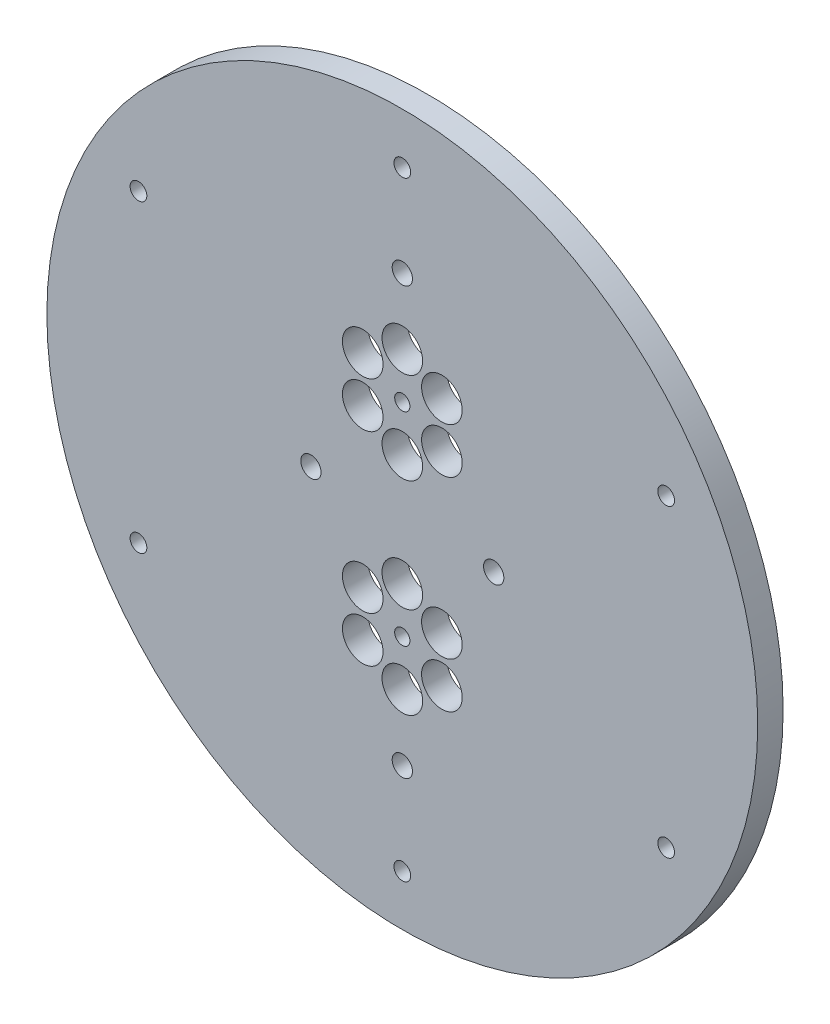
ISO-10303-21;
HEADER;
FILE_DESCRIPTION(('STEP AP214'),'2;1');
FILE_NAME('part.step','',(''),(''),'','','');
FILE_SCHEMA(('AUTOMOTIVE_DESIGN { 1 0 10303 214 1 1 1 1 }'));
ENDSEC;
DATA;
#1=APPLICATION_CONTEXT('core data for automotive mechanical design processes');
#2=APPLICATION_PROTOCOL_DEFINITION('international standard','automotive_design',2000,#1);
#3=PRODUCT_CONTEXT('',#1,'mechanical');
#4=PRODUCT('Part','Part','',(#3));
#5=PRODUCT_RELATED_PRODUCT_CATEGORY('part','',(#4));
#6=PRODUCT_DEFINITION_FORMATION('','',#4);
#7=PRODUCT_DEFINITION_CONTEXT('part definition',#1,'design');
#8=PRODUCT_DEFINITION('design','',#6,#7);
#9=PRODUCT_DEFINITION_SHAPE('','',#8);
#10=(LENGTH_UNIT() NAMED_UNIT(*) SI_UNIT(.MILLI.,.METRE.));
#11=(NAMED_UNIT(*) PLANE_ANGLE_UNIT() SI_UNIT($,.RADIAN.));
#12=(NAMED_UNIT(*) SI_UNIT($,.STERADIAN.) SOLID_ANGLE_UNIT());
#13=UNCERTAINTY_MEASURE_WITH_UNIT(LENGTH_MEASURE(1.E-05),#10,'distance_accuracy_value','');
#14=(GEOMETRIC_REPRESENTATION_CONTEXT(3) GLOBAL_UNCERTAINTY_ASSIGNED_CONTEXT((#13)) GLOBAL_UNIT_ASSIGNED_CONTEXT((#10,
#11,#12)) REPRESENTATION_CONTEXT('',''));
#15=CARTESIAN_POINT('',(0.,0.,0.));
#16=DIRECTION('',(0.,0.,1.));
#17=DIRECTION('',(1.,0.,0.));
#18=AXIS2_PLACEMENT_3D('',#15,#16,#17);
#19=CARTESIAN_POINT('',(0.,0.,5.));
#20=DIRECTION('',(0.,0.,1.));
#21=DIRECTION('',(1.,0.,0.));
#22=AXIS2_PLACEMENT_3D('',#19,#20,#21);
#23=PLANE('',#22);
#24=CARTESIAN_POINT('',(0.,42.,5.));
#25=DIRECTION('',(0.,0.,1.));
#26=DIRECTION('',(1.,0.,0.));
#27=AXIS2_PLACEMENT_3D('',#24,#25,#26);
#28=CIRCLE('',#27,2.);
#29=CARTESIAN_POINT('',(2.,42.,5.));
#30=VERTEX_POINT('',#29);
#31=EDGE_CURVE('E182',#30,#30,#28,.T.);
#32=ORIENTED_EDGE('',*,*,#31,.F.);
#33=EDGE_LOOP('',(#32));
#34=FACE_BOUND('',#33,.T.);
#35=CARTESIAN_POINT('',(0.,-42.,5.));
#36=DIRECTION('',(0.,0.,1.));
#37=DIRECTION('',(1.,0.,0.));
#38=AXIS2_PLACEMENT_3D('',#35,#36,#37);
#39=CIRCLE('',#38,2.);
#40=CARTESIAN_POINT('',(2.,-42.,5.));
#41=VERTEX_POINT('',#40);
#42=EDGE_CURVE('E176',#41,#41,#39,.T.);
#43=ORIENTED_EDGE('',*,*,#42,.F.);
#44=EDGE_LOOP('',(#43));
#45=FACE_BOUND('',#44,.T.);
#46=CARTESIAN_POINT('',(18.,0.,5.));
#47=DIRECTION('',(0.,0.,1.));
#48=DIRECTION('',(1.,0.,0.));
#49=AXIS2_PLACEMENT_3D('',#46,#47,#48);
#50=CIRCLE('',#49,2.00000000000001);
#51=CARTESIAN_POINT('',(20.,0.,5.));
#52=VERTEX_POINT('',#51);
#53=EDGE_CURVE('E170',#52,#52,#50,.T.);
#54=ORIENTED_EDGE('',*,*,#53,.F.);
#55=EDGE_LOOP('',(#54));
#56=FACE_BOUND('',#55,.T.);
#57=CARTESIAN_POINT('',(-18.,0.,5.));
#58=DIRECTION('',(0.,0.,1.));
#59=DIRECTION('',(1.,0.,0.));
#60=AXIS2_PLACEMENT_3D('',#57,#58,#59);
#61=CIRCLE('',#60,2.);
#62=CARTESIAN_POINT('',(-16.,0.,5.));
#63=VERTEX_POINT('',#62);
#64=EDGE_CURVE('E164',#63,#63,#61,.T.);
#65=ORIENTED_EDGE('',*,*,#64,.F.);
#66=EDGE_LOOP('',(#65));
#67=FACE_BOUND('',#66,.T.);
#68=CARTESIAN_POINT('',(0.,-29.,5.));
#69=DIRECTION('',(0.,0.,1.));
#70=DIRECTION('',(-1.,0.,0.));
#71=AXIS2_PLACEMENT_3D('',#68,#69,#70);
#72=CIRCLE('',#71,4.);
#73=CARTESIAN_POINT('',(-4.,-29.,5.));
#74=VERTEX_POINT('',#73);
#75=EDGE_CURVE('E149',#74,#74,#72,.T.);
#76=ORIENTED_EDGE('',*,*,#75,.F.);
#77=EDGE_LOOP('',(#76));
#78=FACE_BOUND('',#77,.T.);
#79=CARTESIAN_POINT('',(0.,-20.,5.));
#80=DIRECTION('',(0.,0.,1.));
#81=DIRECTION('',(-1.,0.,0.));
#82=AXIS2_PLACEMENT_3D('',#79,#80,#81);
#83=CIRCLE('',#82,1.5);
#84=CARTESIAN_POINT('',(-1.5,-20.,5.));
#85=VERTEX_POINT('',#84);
#86=EDGE_CURVE('E137',#85,#85,#83,.T.);
#87=ORIENTED_EDGE('',*,*,#86,.F.);
#88=EDGE_LOOP('',(#87));
#89=FACE_BOUND('',#88,.T.);
#90=CARTESIAN_POINT('',(0.,-11.,5.));
#91=DIRECTION('',(0.,0.,1.));
#92=DIRECTION('',(-1.,0.,0.));
#93=AXIS2_PLACEMENT_3D('',#90,#91,#92);
#94=CIRCLE('',#93,4.);
#95=CARTESIAN_POINT('',(-3.99999999999999,-11.,5.));
#96=VERTEX_POINT('',#95);
#97=EDGE_CURVE('E125',#96,#96,#94,.T.);
#98=ORIENTED_EDGE('',*,*,#97,.F.);
#99=EDGE_LOOP('',(#98));
#100=FACE_BOUND('',#99,.T.);
#101=CARTESIAN_POINT('',(-7.79422863405994,24.5,5.));
#102=DIRECTION('',(0.,0.,1.));
#103=DIRECTION('',(1.,0.,0.));
#104=AXIS2_PLACEMENT_3D('',#101,#102,#103);
#105=CIRCLE('',#104,4.);
#106=CARTESIAN_POINT('',(-3.79422863405994,24.5,5.));
#107=VERTEX_POINT('',#106);
#108=EDGE_CURVE('E113',#107,#107,#105,.T.);
#109=ORIENTED_EDGE('',*,*,#108,.F.);
#110=EDGE_LOOP('',(#109));
#111=FACE_BOUND('',#110,.T.);
#112=CARTESIAN_POINT('',(0.,11.,5.));
#113=DIRECTION('',(0.,0.,1.));
#114=DIRECTION('',(1.,0.,0.));
#115=AXIS2_PLACEMENT_3D('',#112,#113,#114);
#116=CIRCLE('',#115,4.);
#117=CARTESIAN_POINT('',(4.00000000000001,11.,5.));
#118=VERTEX_POINT('',#117);
#119=EDGE_CURVE('E101',#118,#118,#116,.T.);
#120=ORIENTED_EDGE('',*,*,#119,.F.);
#121=EDGE_LOOP('',(#120));
#122=FACE_BOUND('',#121,.T.);
#123=CARTESIAN_POINT('',(7.79422863405995,24.5,5.));
#124=DIRECTION('',(0.,0.,1.));
#125=DIRECTION('',(1.,0.,0.));
#126=AXIS2_PLACEMENT_3D('',#123,#124,#125);
#127=CIRCLE('',#126,4.);
#128=CARTESIAN_POINT('',(11.79422863406,24.5,5.));
#129=VERTEX_POINT('',#128);
#130=EDGE_CURVE('E89',#129,#129,#127,.T.);
#131=ORIENTED_EDGE('',*,*,#130,.F.);
#132=EDGE_LOOP('',(#131));
#133=FACE_BOUND('',#132,.T.);
#134=CARTESIAN_POINT('',(0.,29.,5.));
#135=DIRECTION('',(0.,0.,1.));
#136=DIRECTION('',(1.,0.,0.));
#137=AXIS2_PLACEMENT_3D('',#134,#135,#136);
#138=CIRCLE('',#137,4.);
#139=CARTESIAN_POINT('',(4.,29.,5.));
#140=VERTEX_POINT('',#139);
#141=EDGE_CURVE('E77',#140,#140,#138,.T.);
#142=ORIENTED_EDGE('',*,*,#141,.F.);
#143=EDGE_LOOP('',(#142));
#144=FACE_BOUND('',#143,.T.);
#145=CARTESIAN_POINT('',(-51.9615242270663,-30.,5.));
#146=DIRECTION('',(0.,0.,1.));
#147=DIRECTION('',(1.,0.,0.));
#148=AXIS2_PLACEMENT_3D('',#145,#146,#147);
#149=CIRCLE('',#148,1.65);
#150=CARTESIAN_POINT('',(-50.3115242270663,-30.,5.));
#151=VERTEX_POINT('',#150);
#152=EDGE_CURVE('E65',#151,#151,#149,.T.);
#153=ORIENTED_EDGE('',*,*,#152,.F.);
#154=EDGE_LOOP('',(#153));
#155=FACE_BOUND('',#154,.T.);
#156=CARTESIAN_POINT('',(51.9615242270663,-30.,5.));
#157=DIRECTION('',(0.,0.,1.));
#158=DIRECTION('',(1.,0.,0.));
#159=AXIS2_PLACEMENT_3D('',#156,#157,#158);
#160=CIRCLE('',#159,1.65000000000015);
#161=CARTESIAN_POINT('',(53.6115242270665,-30.,5.));
#162=VERTEX_POINT('',#161);
#163=EDGE_CURVE('E53',#162,#162,#160,.T.);
#164=ORIENTED_EDGE('',*,*,#163,.F.);
#165=EDGE_LOOP('',(#164));
#166=FACE_BOUND('',#165,.T.);
#167=CARTESIAN_POINT('',(0.,60.,5.));
#168=DIRECTION('',(0.,0.,1.));
#169=DIRECTION('',(1.,0.,0.));
#170=AXIS2_PLACEMENT_3D('',#167,#168,#169);
#171=CIRCLE('',#170,1.65);
#172=CARTESIAN_POINT('',(1.65,60.,5.));
#173=VERTEX_POINT('',#172);
#174=EDGE_CURVE('E42',#173,#173,#171,.T.);
#175=ORIENTED_EDGE('',*,*,#174,.F.);
#176=EDGE_LOOP('',(#175));
#177=FACE_BOUND('',#176,.T.);
#178=CARTESIAN_POINT('',(0.,0.,5.));
#179=DIRECTION('',(0.,0.,1.));
#180=DIRECTION('',(1.,0.,0.));
#181=AXIS2_PLACEMENT_3D('',#178,#179,#180);
#182=CIRCLE('',#181,70.);
#183=CARTESIAN_POINT('',(70.,0.,5.));
#184=VERTEX_POINT('',#183);
#185=EDGE_CURVE('E10',#184,#184,#182,.T.);
#186=ORIENTED_EDGE('',*,*,#185,.T.);
#187=EDGE_LOOP('',(#186));
#188=FACE_BOUND('',#187,.T.);
#189=CARTESIAN_POINT('',(51.9615242270663,30.,5.));
#190=DIRECTION('',(0.,0.,1.));
#191=DIRECTION('',(1.,0.,0.));
#192=AXIS2_PLACEMENT_3D('',#189,#190,#191);
#193=CIRCLE('',#192,1.65000000000008);
#194=CARTESIAN_POINT('',(53.6115242270664,30.,5.));
#195=VERTEX_POINT('',#194);
#196=EDGE_CURVE('E47',#195,#195,#193,.T.);
#197=ORIENTED_EDGE('',*,*,#196,.F.);
#198=EDGE_LOOP('',(#197));
#199=FACE_BOUND('',#198,.T.);
#200=CARTESIAN_POINT('',(0.,-60.,5.));
#201=DIRECTION('',(0.,0.,1.));
#202=DIRECTION('',(1.,0.,0.));
#203=AXIS2_PLACEMENT_3D('',#200,#201,#202);
#204=CIRCLE('',#203,1.65);
#205=CARTESIAN_POINT('',(1.65000000000001,-60.,5.));
#206=VERTEX_POINT('',#205);
#207=EDGE_CURVE('E59',#206,#206,#204,.T.);
#208=ORIENTED_EDGE('',*,*,#207,.F.);
#209=EDGE_LOOP('',(#208));
#210=FACE_BOUND('',#209,.T.);
#211=CARTESIAN_POINT('',(-51.9615242270663,30.,5.));
#212=DIRECTION('',(0.,0.,1.));
#213=DIRECTION('',(1.,0.,0.));
#214=AXIS2_PLACEMENT_3D('',#211,#212,#213);
#215=CIRCLE('',#214,1.65);
#216=CARTESIAN_POINT('',(-50.3115242270664,30.,5.));
#217=VERTEX_POINT('',#216);
#218=EDGE_CURVE('E71',#217,#217,#215,.T.);
#219=ORIENTED_EDGE('',*,*,#218,.F.);
#220=EDGE_LOOP('',(#219));
#221=FACE_BOUND('',#220,.T.);
#222=CARTESIAN_POINT('',(0.,20.,5.));
#223=DIRECTION('',(0.,0.,1.));
#224=DIRECTION('',(1.,0.,0.));
#225=AXIS2_PLACEMENT_3D('',#222,#223,#224);
#226=CIRCLE('',#225,1.5);
#227=CARTESIAN_POINT('',(1.5,20.,5.));
#228=VERTEX_POINT('',#227);
#229=EDGE_CURVE('E83',#228,#228,#226,.T.);
#230=ORIENTED_EDGE('',*,*,#229,.F.);
#231=EDGE_LOOP('',(#230));
#232=FACE_BOUND('',#231,.T.);
#233=CARTESIAN_POINT('',(7.79422863405995,15.5,5.));
#234=DIRECTION('',(0.,0.,1.));
#235=DIRECTION('',(1.,0.,0.));
#236=AXIS2_PLACEMENT_3D('',#233,#234,#235);
#237=CIRCLE('',#236,4.);
#238=CARTESIAN_POINT('',(11.79422863406,15.5,5.));
#239=VERTEX_POINT('',#238);
#240=EDGE_CURVE('E95',#239,#239,#237,.T.);
#241=ORIENTED_EDGE('',*,*,#240,.F.);
#242=EDGE_LOOP('',(#241));
#243=FACE_BOUND('',#242,.T.);
#244=CARTESIAN_POINT('',(-7.79422863405994,15.5,5.));
#245=DIRECTION('',(0.,0.,1.));
#246=DIRECTION('',(1.,0.,0.));
#247=AXIS2_PLACEMENT_3D('',#244,#245,#246);
#248=CIRCLE('',#247,4.);
#249=CARTESIAN_POINT('',(-3.79422863405994,15.5,5.));
#250=VERTEX_POINT('',#249);
#251=EDGE_CURVE('E107',#250,#250,#248,.T.);
#252=ORIENTED_EDGE('',*,*,#251,.F.);
#253=EDGE_LOOP('',(#252));
#254=FACE_BOUND('',#253,.T.);
#255=CARTESIAN_POINT('',(7.79422863405995,-15.5,5.));
#256=DIRECTION('',(0.,0.,1.));
#257=DIRECTION('',(-1.,0.,0.));
#258=AXIS2_PLACEMENT_3D('',#255,#256,#257);
#259=CIRCLE('',#258,4.);
#260=CARTESIAN_POINT('',(3.79422863405995,-15.5,5.));
#261=VERTEX_POINT('',#260);
#262=EDGE_CURVE('E119',#261,#261,#259,.T.);
#263=ORIENTED_EDGE('',*,*,#262,.F.);
#264=EDGE_LOOP('',(#263));
#265=FACE_BOUND('',#264,.T.);
#266=CARTESIAN_POINT('',(-7.79422863405994,-15.5,5.));
#267=DIRECTION('',(0.,0.,1.));
#268=DIRECTION('',(-1.,0.,0.));
#269=AXIS2_PLACEMENT_3D('',#266,#267,#268);
#270=CIRCLE('',#269,4.);
#271=CARTESIAN_POINT('',(-11.7942286340599,-15.5,5.));
#272=VERTEX_POINT('',#271);
#273=EDGE_CURVE('E131',#272,#272,#270,.T.);
#274=ORIENTED_EDGE('',*,*,#273,.F.);
#275=EDGE_LOOP('',(#274));
#276=FACE_BOUND('',#275,.T.);
#277=CARTESIAN_POINT('',(-7.79422863405994,-24.5,5.));
#278=DIRECTION('',(0.,0.,1.));
#279=DIRECTION('',(-1.,0.,0.));
#280=AXIS2_PLACEMENT_3D('',#277,#278,#279);
#281=CIRCLE('',#280,4.);
#282=CARTESIAN_POINT('',(-11.7942286340599,-24.5,5.));
#283=VERTEX_POINT('',#282);
#284=EDGE_CURVE('E143',#283,#283,#281,.T.);
#285=ORIENTED_EDGE('',*,*,#284,.F.);
#286=EDGE_LOOP('',(#285));
#287=FACE_BOUND('',#286,.T.);
#288=CARTESIAN_POINT('',(7.79422863405995,-24.5,5.));
#289=DIRECTION('',(0.,0.,1.));
#290=DIRECTION('',(-1.,0.,0.));
#291=AXIS2_PLACEMENT_3D('',#288,#289,#290);
#292=CIRCLE('',#291,4.);
#293=CARTESIAN_POINT('',(3.79422863405995,-24.5,5.));
#294=VERTEX_POINT('',#293);
#295=EDGE_CURVE('E155',#294,#294,#292,.T.);
#296=ORIENTED_EDGE('',*,*,#295,.F.);
#297=EDGE_LOOP('',(#296));
#298=FACE_BOUND('',#297,.T.);
#299=ADVANCED_FACE('F31',(#34,#45,#56,#67,#78,#89,#100,#111,#122,#133,#144,#155,#166,#177,#188,
#199,#210,#221,#232,#243,#254,#265,#276,#287,#298),#23,.T.);
#300=CARTESIAN_POINT('',(0.,0.,0.));
#301=DIRECTION('',(0.,0.,1.));
#302=DIRECTION('',(1.,0.,0.));
#303=AXIS2_PLACEMENT_3D('',#300,#301,#302);
#304=PLANE('',#303);
#305=CARTESIAN_POINT('',(0.,42.,0.));
#306=DIRECTION('',(0.,0.,1.));
#307=DIRECTION('',(1.,0.,0.));
#308=AXIS2_PLACEMENT_3D('',#305,#306,#307);
#309=CIRCLE('',#308,2.);
#310=CARTESIAN_POINT('',(2.,42.,0.));
#311=VERTEX_POINT('',#310);
#312=EDGE_CURVE('E161',#311,#311,#309,.T.);
#313=ORIENTED_EDGE('',*,*,#312,.T.);
#314=EDGE_LOOP('',(#313));
#315=FACE_BOUND('',#314,.T.);
#316=CARTESIAN_POINT('',(0.,-42.,0.));
#317=DIRECTION('',(0.,0.,1.));
#318=DIRECTION('',(1.,0.,0.));
#319=AXIS2_PLACEMENT_3D('',#316,#317,#318);
#320=CIRCLE('',#319,2.);
#321=CARTESIAN_POINT('',(2.,-42.,0.));
#322=VERTEX_POINT('',#321);
#323=EDGE_CURVE('E179',#322,#322,#320,.T.);
#324=ORIENTED_EDGE('',*,*,#323,.T.);
#325=EDGE_LOOP('',(#324));
#326=FACE_BOUND('',#325,.T.);
#327=CARTESIAN_POINT('',(18.,0.,0.));
#328=DIRECTION('',(0.,0.,1.));
#329=DIRECTION('',(1.,0.,0.));
#330=AXIS2_PLACEMENT_3D('',#327,#328,#329);
#331=CIRCLE('',#330,2.00000000000001);
#332=CARTESIAN_POINT('',(20.,0.,0.));
#333=VERTEX_POINT('',#332);
#334=EDGE_CURVE('E173',#333,#333,#331,.T.);
#335=ORIENTED_EDGE('',*,*,#334,.T.);
#336=EDGE_LOOP('',(#335));
#337=FACE_BOUND('',#336,.T.);
#338=CARTESIAN_POINT('',(-18.,0.,0.));
#339=DIRECTION('',(0.,0.,1.));
#340=DIRECTION('',(1.,0.,0.));
#341=AXIS2_PLACEMENT_3D('',#338,#339,#340);
#342=CIRCLE('',#341,2.);
#343=CARTESIAN_POINT('',(-16.,0.,0.));
#344=VERTEX_POINT('',#343);
#345=EDGE_CURVE('E167',#344,#344,#342,.T.);
#346=ORIENTED_EDGE('',*,*,#345,.T.);
#347=EDGE_LOOP('',(#346));
#348=FACE_BOUND('',#347,.T.);
#349=CARTESIAN_POINT('',(0.,0.,0.));
#350=DIRECTION('',(0.,0.,1.));
#351=DIRECTION('',(1.,0.,0.));
#352=AXIS2_PLACEMENT_3D('',#349,#350,#351);
#353=CIRCLE('',#352,70.);
#354=CARTESIAN_POINT('',(70.,0.,0.));
#355=VERTEX_POINT('',#354);
#356=EDGE_CURVE('E35',#355,#355,#353,.T.);
#357=ORIENTED_EDGE('',*,*,#356,.F.);
#358=EDGE_LOOP('',(#357));
#359=FACE_BOUND('',#358,.T.);
#360=CARTESIAN_POINT('',(0.,60.,0.));
#361=DIRECTION('',(0.,0.,1.));
#362=DIRECTION('',(1.,0.,0.));
#363=AXIS2_PLACEMENT_3D('',#360,#361,#362);
#364=CIRCLE('',#363,1.65);
#365=CARTESIAN_POINT('',(1.65,60.,0.));
#366=VERTEX_POINT('',#365);
#367=EDGE_CURVE('E44',#366,#366,#364,.T.);
#368=ORIENTED_EDGE('',*,*,#367,.T.);
#369=EDGE_LOOP('',(#368));
#370=FACE_BOUND('',#369,.T.);
#371=CARTESIAN_POINT('',(51.9615242270663,30.,0.));
#372=DIRECTION('',(0.,0.,1.));
#373=DIRECTION('',(1.,0.,0.));
#374=AXIS2_PLACEMENT_3D('',#371,#372,#373);
#375=CIRCLE('',#374,1.65000000000008);
#376=CARTESIAN_POINT('',(53.6115242270664,30.,0.));
#377=VERTEX_POINT('',#376);
#378=EDGE_CURVE('E50',#377,#377,#375,.T.);
#379=ORIENTED_EDGE('',*,*,#378,.T.);
#380=EDGE_LOOP('',(#379));
#381=FACE_BOUND('',#380,.T.);
#382=CARTESIAN_POINT('',(51.9615242270663,-30.,0.));
#383=DIRECTION('',(0.,0.,1.));
#384=DIRECTION('',(1.,0.,0.));
#385=AXIS2_PLACEMENT_3D('',#382,#383,#384);
#386=CIRCLE('',#385,1.65000000000015);
#387=CARTESIAN_POINT('',(53.6115242270665,-30.,0.));
#388=VERTEX_POINT('',#387);
#389=EDGE_CURVE('E56',#388,#388,#386,.T.);
#390=ORIENTED_EDGE('',*,*,#389,.T.);
#391=EDGE_LOOP('',(#390));
#392=FACE_BOUND('',#391,.T.);
#393=CARTESIAN_POINT('',(0.,-60.,0.));
#394=DIRECTION('',(0.,0.,1.));
#395=DIRECTION('',(1.,0.,0.));
#396=AXIS2_PLACEMENT_3D('',#393,#394,#395);
#397=CIRCLE('',#396,1.65);
#398=CARTESIAN_POINT('',(1.65000000000001,-60.,0.));
#399=VERTEX_POINT('',#398);
#400=EDGE_CURVE('E62',#399,#399,#397,.T.);
#401=ORIENTED_EDGE('',*,*,#400,.T.);
#402=EDGE_LOOP('',(#401));
#403=FACE_BOUND('',#402,.T.);
#404=CARTESIAN_POINT('',(-51.9615242270663,-30.,0.));
#405=DIRECTION('',(0.,0.,1.));
#406=DIRECTION('',(1.,0.,0.));
#407=AXIS2_PLACEMENT_3D('',#404,#405,#406);
#408=CIRCLE('',#407,1.65);
#409=CARTESIAN_POINT('',(-50.3115242270663,-30.,0.));
#410=VERTEX_POINT('',#409);
#411=EDGE_CURVE('E68',#410,#410,#408,.T.);
#412=ORIENTED_EDGE('',*,*,#411,.T.);
#413=EDGE_LOOP('',(#412));
#414=FACE_BOUND('',#413,.T.);
#415=CARTESIAN_POINT('',(-51.9615242270663,30.,0.));
#416=DIRECTION('',(0.,0.,1.));
#417=DIRECTION('',(1.,0.,0.));
#418=AXIS2_PLACEMENT_3D('',#415,#416,#417);
#419=CIRCLE('',#418,1.65);
#420=CARTESIAN_POINT('',(-50.3115242270664,30.,0.));
#421=VERTEX_POINT('',#420);
#422=EDGE_CURVE('E74',#421,#421,#419,.T.);
#423=ORIENTED_EDGE('',*,*,#422,.T.);
#424=EDGE_LOOP('',(#423));
#425=FACE_BOUND('',#424,.T.);
#426=CARTESIAN_POINT('',(0.,29.,0.));
#427=DIRECTION('',(0.,0.,1.));
#428=DIRECTION('',(1.,0.,0.));
#429=AXIS2_PLACEMENT_3D('',#426,#427,#428);
#430=CIRCLE('',#429,4.);
#431=CARTESIAN_POINT('',(4.,29.,0.));
#432=VERTEX_POINT('',#431);
#433=EDGE_CURVE('E80',#432,#432,#430,.T.);
#434=ORIENTED_EDGE('',*,*,#433,.T.);
#435=EDGE_LOOP('',(#434));
#436=FACE_BOUND('',#435,.T.);
#437=CARTESIAN_POINT('',(0.,20.,0.));
#438=DIRECTION('',(0.,0.,1.));
#439=DIRECTION('',(1.,0.,0.));
#440=AXIS2_PLACEMENT_3D('',#437,#438,#439);
#441=CIRCLE('',#440,1.5);
#442=CARTESIAN_POINT('',(1.5,20.,0.));
#443=VERTEX_POINT('',#442);
#444=EDGE_CURVE('E86',#443,#443,#441,.T.);
#445=ORIENTED_EDGE('',*,*,#444,.T.);
#446=EDGE_LOOP('',(#445));
#447=FACE_BOUND('',#446,.T.);
#448=CARTESIAN_POINT('',(7.79422863405995,24.5,0.));
#449=DIRECTION('',(0.,0.,1.));
#450=DIRECTION('',(1.,0.,0.));
#451=AXIS2_PLACEMENT_3D('',#448,#449,#450);
#452=CIRCLE('',#451,4.);
#453=CARTESIAN_POINT('',(11.79422863406,24.5,0.));
#454=VERTEX_POINT('',#453);
#455=EDGE_CURVE('E92',#454,#454,#452,.T.);
#456=ORIENTED_EDGE('',*,*,#455,.T.);
#457=EDGE_LOOP('',(#456));
#458=FACE_BOUND('',#457,.T.);
#459=CARTESIAN_POINT('',(7.79422863405995,15.5,0.));
#460=DIRECTION('',(0.,0.,1.));
#461=DIRECTION('',(1.,0.,0.));
#462=AXIS2_PLACEMENT_3D('',#459,#460,#461);
#463=CIRCLE('',#462,4.);
#464=CARTESIAN_POINT('',(11.79422863406,15.5,0.));
#465=VERTEX_POINT('',#464);
#466=EDGE_CURVE('E98',#465,#465,#463,.T.);
#467=ORIENTED_EDGE('',*,*,#466,.T.);
#468=EDGE_LOOP('',(#467));
#469=FACE_BOUND('',#468,.T.);
#470=CARTESIAN_POINT('',(0.,11.,0.));
#471=DIRECTION('',(0.,0.,1.));
#472=DIRECTION('',(1.,0.,0.));
#473=AXIS2_PLACEMENT_3D('',#470,#471,#472);
#474=CIRCLE('',#473,4.);
#475=CARTESIAN_POINT('',(4.00000000000001,11.,0.));
#476=VERTEX_POINT('',#475);
#477=EDGE_CURVE('E104',#476,#476,#474,.T.);
#478=ORIENTED_EDGE('',*,*,#477,.T.);
#479=EDGE_LOOP('',(#478));
#480=FACE_BOUND('',#479,.T.);
#481=CARTESIAN_POINT('',(-7.79422863405994,15.5,0.));
#482=DIRECTION('',(0.,0.,1.));
#483=DIRECTION('',(1.,0.,0.));
#484=AXIS2_PLACEMENT_3D('',#481,#482,#483);
#485=CIRCLE('',#484,4.);
#486=CARTESIAN_POINT('',(-3.79422863405994,15.5,0.));
#487=VERTEX_POINT('',#486);
#488=EDGE_CURVE('E110',#487,#487,#485,.T.);
#489=ORIENTED_EDGE('',*,*,#488,.T.);
#490=EDGE_LOOP('',(#489));
#491=FACE_BOUND('',#490,.T.);
#492=CARTESIAN_POINT('',(-7.79422863405994,24.5,0.));
#493=DIRECTION('',(0.,0.,1.));
#494=DIRECTION('',(1.,0.,0.));
#495=AXIS2_PLACEMENT_3D('',#492,#493,#494);
#496=CIRCLE('',#495,4.);
#497=CARTESIAN_POINT('',(-3.79422863405994,24.5,0.));
#498=VERTEX_POINT('',#497);
#499=EDGE_CURVE('E116',#498,#498,#496,.T.);
#500=ORIENTED_EDGE('',*,*,#499,.T.);
#501=EDGE_LOOP('',(#500));
#502=FACE_BOUND('',#501,.T.);
#503=CARTESIAN_POINT('',(7.79422863405995,-15.5,0.));
#504=DIRECTION('',(0.,0.,1.));
#505=DIRECTION('',(-1.,0.,0.));
#506=AXIS2_PLACEMENT_3D('',#503,#504,#505);
#507=CIRCLE('',#506,4.);
#508=CARTESIAN_POINT('',(3.79422863405995,-15.5,0.));
#509=VERTEX_POINT('',#508);
#510=EDGE_CURVE('E122',#509,#509,#507,.T.);
#511=ORIENTED_EDGE('',*,*,#510,.T.);
#512=EDGE_LOOP('',(#511));
#513=FACE_BOUND('',#512,.T.);
#514=CARTESIAN_POINT('',(0.,-11.,0.));
#515=DIRECTION('',(0.,0.,1.));
#516=DIRECTION('',(-1.,0.,0.));
#517=AXIS2_PLACEMENT_3D('',#514,#515,#516);
#518=CIRCLE('',#517,4.);
#519=CARTESIAN_POINT('',(-3.99999999999999,-11.,0.));
#520=VERTEX_POINT('',#519);
#521=EDGE_CURVE('E128',#520,#520,#518,.T.);
#522=ORIENTED_EDGE('',*,*,#521,.T.);
#523=EDGE_LOOP('',(#522));
#524=FACE_BOUND('',#523,.T.);
#525=CARTESIAN_POINT('',(-7.79422863405994,-15.5,0.));
#526=DIRECTION('',(0.,0.,1.));
#527=DIRECTION('',(-1.,0.,0.));
#528=AXIS2_PLACEMENT_3D('',#525,#526,#527);
#529=CIRCLE('',#528,4.);
#530=CARTESIAN_POINT('',(-11.7942286340599,-15.5,0.));
#531=VERTEX_POINT('',#530);
#532=EDGE_CURVE('E134',#531,#531,#529,.T.);
#533=ORIENTED_EDGE('',*,*,#532,.T.);
#534=EDGE_LOOP('',(#533));
#535=FACE_BOUND('',#534,.T.);
#536=CARTESIAN_POINT('',(0.,-20.,0.));
#537=DIRECTION('',(0.,0.,1.));
#538=DIRECTION('',(-1.,0.,0.));
#539=AXIS2_PLACEMENT_3D('',#536,#537,#538);
#540=CIRCLE('',#539,1.5);
#541=CARTESIAN_POINT('',(-1.5,-20.,0.));
#542=VERTEX_POINT('',#541);
#543=EDGE_CURVE('E140',#542,#542,#540,.T.);
#544=ORIENTED_EDGE('',*,*,#543,.T.);
#545=EDGE_LOOP('',(#544));
#546=FACE_BOUND('',#545,.T.);
#547=CARTESIAN_POINT('',(-7.79422863405994,-24.5,0.));
#548=DIRECTION('',(0.,0.,1.));
#549=DIRECTION('',(-1.,0.,0.));
#550=AXIS2_PLACEMENT_3D('',#547,#548,#549);
#551=CIRCLE('',#550,4.);
#552=CARTESIAN_POINT('',(-11.7942286340599,-24.5,0.));
#553=VERTEX_POINT('',#552);
#554=EDGE_CURVE('E146',#553,#553,#551,.T.);
#555=ORIENTED_EDGE('',*,*,#554,.T.);
#556=EDGE_LOOP('',(#555));
#557=FACE_BOUND('',#556,.T.);
#558=CARTESIAN_POINT('',(0.,-29.,0.));
#559=DIRECTION('',(0.,0.,1.));
#560=DIRECTION('',(-1.,0.,0.));
#561=AXIS2_PLACEMENT_3D('',#558,#559,#560);
#562=CIRCLE('',#561,4.);
#563=CARTESIAN_POINT('',(-4.,-29.,0.));
#564=VERTEX_POINT('',#563);
#565=EDGE_CURVE('E152',#564,#564,#562,.T.);
#566=ORIENTED_EDGE('',*,*,#565,.T.);
#567=EDGE_LOOP('',(#566));
#568=FACE_BOUND('',#567,.T.);
#569=CARTESIAN_POINT('',(7.79422863405995,-24.5,0.));
#570=DIRECTION('',(0.,0.,1.));
#571=DIRECTION('',(-1.,0.,0.));
#572=AXIS2_PLACEMENT_3D('',#569,#570,#571);
#573=CIRCLE('',#572,4.);
#574=CARTESIAN_POINT('',(3.79422863405995,-24.5,0.));
#575=VERTEX_POINT('',#574);
#576=EDGE_CURVE('E158',#575,#575,#573,.T.);
#577=ORIENTED_EDGE('',*,*,#576,.T.);
#578=EDGE_LOOP('',(#577));
#579=FACE_BOUND('',#578,.T.);
#580=ADVANCED_FACE('F188',(#315,#326,#337,#348,#359,#370,#381,#392,#403,#414,#425,#436,#447,
#458,#469,#480,#491,#502,#513,#524,#535,#546,#557,#568,#579),#304,.F.);
#581=CARTESIAN_POINT('',(0.,0.,5.));
#582=DIRECTION('',(0.,0.,-1.));
#583=DIRECTION('',(-1.,0.,0.));
#584=AXIS2_PLACEMENT_3D('',#581,#582,#583);
#585=CYLINDRICAL_SURFACE('',#584,70.);
#586=ORIENTED_EDGE('',*,*,#185,.F.);
#587=EDGE_LOOP('',(#586));
#588=FACE_BOUND('',#587,.T.);
#589=ORIENTED_EDGE('',*,*,#356,.T.);
#590=EDGE_LOOP('',(#589));
#591=FACE_BOUND('',#590,.T.);
#592=ADVANCED_FACE('F33',(#588,#591),#585,.T.);
#593=CARTESIAN_POINT('',(0.,60.,5.));
#594=DIRECTION('',(0.,0.,-1.));
#595=DIRECTION('',(-1.,0.,0.));
#596=AXIS2_PLACEMENT_3D('',#593,#594,#595);
#597=CYLINDRICAL_SURFACE('',#596,1.65);
#598=ORIENTED_EDGE('',*,*,#174,.T.);
#599=EDGE_LOOP('',(#598));
#600=FACE_BOUND('',#599,.T.);
#601=ORIENTED_EDGE('',*,*,#367,.F.);
#602=EDGE_LOOP('',(#601));
#603=FACE_BOUND('',#602,.T.);
#604=ADVANCED_FACE('F260',(#600,#603),#597,.F.);
#605=CARTESIAN_POINT('',(51.9615242270663,30.,5.));
#606=DIRECTION('',(0.,0.,-1.));
#607=DIRECTION('',(-1.,0.,0.));
#608=AXIS2_PLACEMENT_3D('',#605,#606,#607);
#609=CYLINDRICAL_SURFACE('',#608,1.65000000000008);
#610=ORIENTED_EDGE('',*,*,#196,.T.);
#611=EDGE_LOOP('',(#610));
#612=FACE_BOUND('',#611,.T.);
#613=ORIENTED_EDGE('',*,*,#378,.F.);
#614=EDGE_LOOP('',(#613));
#615=FACE_BOUND('',#614,.T.);
#616=ADVANCED_FACE('F265',(#612,#615),#609,.F.);
#617=CARTESIAN_POINT('',(51.9615242270663,-30.,5.));
#618=DIRECTION('',(0.,0.,-1.));
#619=DIRECTION('',(-1.,0.,0.));
#620=AXIS2_PLACEMENT_3D('',#617,#618,#619);
#621=CYLINDRICAL_SURFACE('',#620,1.65000000000015);
#622=ORIENTED_EDGE('',*,*,#163,.T.);
#623=EDGE_LOOP('',(#622));
#624=FACE_BOUND('',#623,.T.);
#625=ORIENTED_EDGE('',*,*,#389,.F.);
#626=EDGE_LOOP('',(#625));
#627=FACE_BOUND('',#626,.T.);
#628=ADVANCED_FACE('F269',(#624,#627),#621,.F.);
#629=CARTESIAN_POINT('',(0.,-60.,5.));
#630=DIRECTION('',(0.,0.,-1.));
#631=DIRECTION('',(-1.,0.,0.));
#632=AXIS2_PLACEMENT_3D('',#629,#630,#631);
#633=CYLINDRICAL_SURFACE('',#632,1.65);
#634=ORIENTED_EDGE('',*,*,#207,.T.);
#635=EDGE_LOOP('',(#634));
#636=FACE_BOUND('',#635,.T.);
#637=ORIENTED_EDGE('',*,*,#400,.F.);
#638=EDGE_LOOP('',(#637));
#639=FACE_BOUND('',#638,.T.);
#640=ADVANCED_FACE('F273',(#636,#639),#633,.F.);
#641=CARTESIAN_POINT('',(-51.9615242270663,-30.,5.));
#642=DIRECTION('',(0.,0.,-1.));
#643=DIRECTION('',(-1.,0.,0.));
#644=AXIS2_PLACEMENT_3D('',#641,#642,#643);
#645=CYLINDRICAL_SURFACE('',#644,1.65);
#646=ORIENTED_EDGE('',*,*,#152,.T.);
#647=EDGE_LOOP('',(#646));
#648=FACE_BOUND('',#647,.T.);
#649=ORIENTED_EDGE('',*,*,#411,.F.);
#650=EDGE_LOOP('',(#649));
#651=FACE_BOUND('',#650,.T.);
#652=ADVANCED_FACE('F277',(#648,#651),#645,.F.);
#653=CARTESIAN_POINT('',(-51.9615242270663,30.,5.));
#654=DIRECTION('',(0.,0.,-1.));
#655=DIRECTION('',(-1.,0.,0.));
#656=AXIS2_PLACEMENT_3D('',#653,#654,#655);
#657=CYLINDRICAL_SURFACE('',#656,1.65);
#658=ORIENTED_EDGE('',*,*,#218,.T.);
#659=EDGE_LOOP('',(#658));
#660=FACE_BOUND('',#659,.T.);
#661=ORIENTED_EDGE('',*,*,#422,.F.);
#662=EDGE_LOOP('',(#661));
#663=FACE_BOUND('',#662,.T.);
#664=ADVANCED_FACE('F281',(#660,#663),#657,.F.);
#665=CARTESIAN_POINT('',(0.,29.,5.));
#666=DIRECTION('',(0.,0.,-1.));
#667=DIRECTION('',(-1.,0.,0.));
#668=AXIS2_PLACEMENT_3D('',#665,#666,#667);
#669=CYLINDRICAL_SURFACE('',#668,4.);
#670=ORIENTED_EDGE('',*,*,#141,.T.);
#671=EDGE_LOOP('',(#670));
#672=FACE_BOUND('',#671,.T.);
#673=ORIENTED_EDGE('',*,*,#433,.F.);
#674=EDGE_LOOP('',(#673));
#675=FACE_BOUND('',#674,.T.);
#676=ADVANCED_FACE('F285',(#672,#675),#669,.F.);
#677=CARTESIAN_POINT('',(0.,20.,5.));
#678=DIRECTION('',(0.,0.,-1.));
#679=DIRECTION('',(-1.,0.,0.));
#680=AXIS2_PLACEMENT_3D('',#677,#678,#679);
#681=CYLINDRICAL_SURFACE('',#680,1.5);
#682=ORIENTED_EDGE('',*,*,#229,.T.);
#683=EDGE_LOOP('',(#682));
#684=FACE_BOUND('',#683,.T.);
#685=ORIENTED_EDGE('',*,*,#444,.F.);
#686=EDGE_LOOP('',(#685));
#687=FACE_BOUND('',#686,.T.);
#688=ADVANCED_FACE('F289',(#684,#687),#681,.F.);
#689=CARTESIAN_POINT('',(7.79422863405995,24.5,5.));
#690=DIRECTION('',(0.,0.,-1.));
#691=DIRECTION('',(-1.,0.,0.));
#692=AXIS2_PLACEMENT_3D('',#689,#690,#691);
#693=CYLINDRICAL_SURFACE('',#692,4.);
#694=ORIENTED_EDGE('',*,*,#130,.T.);
#695=EDGE_LOOP('',(#694));
#696=FACE_BOUND('',#695,.T.);
#697=ORIENTED_EDGE('',*,*,#455,.F.);
#698=EDGE_LOOP('',(#697));
#699=FACE_BOUND('',#698,.T.);
#700=ADVANCED_FACE('F293',(#696,#699),#693,.F.);
#701=CARTESIAN_POINT('',(7.79422863405995,15.5,5.));
#702=DIRECTION('',(0.,0.,-1.));
#703=DIRECTION('',(-1.,0.,0.));
#704=AXIS2_PLACEMENT_3D('',#701,#702,#703);
#705=CYLINDRICAL_SURFACE('',#704,4.);
#706=ORIENTED_EDGE('',*,*,#240,.T.);
#707=EDGE_LOOP('',(#706));
#708=FACE_BOUND('',#707,.T.);
#709=ORIENTED_EDGE('',*,*,#466,.F.);
#710=EDGE_LOOP('',(#709));
#711=FACE_BOUND('',#710,.T.);
#712=ADVANCED_FACE('F297',(#708,#711),#705,.F.);
#713=CARTESIAN_POINT('',(0.,11.,5.));
#714=DIRECTION('',(0.,0.,-1.));
#715=DIRECTION('',(-1.,0.,0.));
#716=AXIS2_PLACEMENT_3D('',#713,#714,#715);
#717=CYLINDRICAL_SURFACE('',#716,4.);
#718=ORIENTED_EDGE('',*,*,#119,.T.);
#719=EDGE_LOOP('',(#718));
#720=FACE_BOUND('',#719,.T.);
#721=ORIENTED_EDGE('',*,*,#477,.F.);
#722=EDGE_LOOP('',(#721));
#723=FACE_BOUND('',#722,.T.);
#724=ADVANCED_FACE('F301',(#720,#723),#717,.F.);
#725=CARTESIAN_POINT('',(-7.79422863405994,15.5,5.));
#726=DIRECTION('',(0.,0.,-1.));
#727=DIRECTION('',(-1.,0.,0.));
#728=AXIS2_PLACEMENT_3D('',#725,#726,#727);
#729=CYLINDRICAL_SURFACE('',#728,4.);
#730=ORIENTED_EDGE('',*,*,#251,.T.);
#731=EDGE_LOOP('',(#730));
#732=FACE_BOUND('',#731,.T.);
#733=ORIENTED_EDGE('',*,*,#488,.F.);
#734=EDGE_LOOP('',(#733));
#735=FACE_BOUND('',#734,.T.);
#736=ADVANCED_FACE('F305',(#732,#735),#729,.F.);
#737=CARTESIAN_POINT('',(-7.79422863405994,24.5,5.));
#738=DIRECTION('',(0.,0.,-1.));
#739=DIRECTION('',(-1.,0.,0.));
#740=AXIS2_PLACEMENT_3D('',#737,#738,#739);
#741=CYLINDRICAL_SURFACE('',#740,4.);
#742=ORIENTED_EDGE('',*,*,#108,.T.);
#743=EDGE_LOOP('',(#742));
#744=FACE_BOUND('',#743,.T.);
#745=ORIENTED_EDGE('',*,*,#499,.F.);
#746=EDGE_LOOP('',(#745));
#747=FACE_BOUND('',#746,.T.);
#748=ADVANCED_FACE('F309',(#744,#747),#741,.F.);
#749=CARTESIAN_POINT('',(7.79422863405995,-15.5,5.));
#750=DIRECTION('',(0.,0.,-1.));
#751=DIRECTION('',(-1.,0.,0.));
#752=AXIS2_PLACEMENT_3D('',#749,#750,#751);
#753=CYLINDRICAL_SURFACE('',#752,4.);
#754=ORIENTED_EDGE('',*,*,#262,.T.);
#755=EDGE_LOOP('',(#754));
#756=FACE_BOUND('',#755,.T.);
#757=ORIENTED_EDGE('',*,*,#510,.F.);
#758=EDGE_LOOP('',(#757));
#759=FACE_BOUND('',#758,.T.);
#760=ADVANCED_FACE('F313',(#756,#759),#753,.F.);
#761=CARTESIAN_POINT('',(0.,-11.,5.));
#762=DIRECTION('',(0.,0.,-1.));
#763=DIRECTION('',(-1.,0.,0.));
#764=AXIS2_PLACEMENT_3D('',#761,#762,#763);
#765=CYLINDRICAL_SURFACE('',#764,4.);
#766=ORIENTED_EDGE('',*,*,#97,.T.);
#767=EDGE_LOOP('',(#766));
#768=FACE_BOUND('',#767,.T.);
#769=ORIENTED_EDGE('',*,*,#521,.F.);
#770=EDGE_LOOP('',(#769));
#771=FACE_BOUND('',#770,.T.);
#772=ADVANCED_FACE('F317',(#768,#771),#765,.F.);
#773=CARTESIAN_POINT('',(-7.79422863405994,-15.5,5.));
#774=DIRECTION('',(0.,0.,-1.));
#775=DIRECTION('',(-1.,0.,0.));
#776=AXIS2_PLACEMENT_3D('',#773,#774,#775);
#777=CYLINDRICAL_SURFACE('',#776,4.);
#778=ORIENTED_EDGE('',*,*,#273,.T.);
#779=EDGE_LOOP('',(#778));
#780=FACE_BOUND('',#779,.T.);
#781=ORIENTED_EDGE('',*,*,#532,.F.);
#782=EDGE_LOOP('',(#781));
#783=FACE_BOUND('',#782,.T.);
#784=ADVANCED_FACE('F321',(#780,#783),#777,.F.);
#785=CARTESIAN_POINT('',(0.,-20.,5.));
#786=DIRECTION('',(0.,0.,-1.));
#787=DIRECTION('',(-1.,0.,0.));
#788=AXIS2_PLACEMENT_3D('',#785,#786,#787);
#789=CYLINDRICAL_SURFACE('',#788,1.5);
#790=ORIENTED_EDGE('',*,*,#86,.T.);
#791=EDGE_LOOP('',(#790));
#792=FACE_BOUND('',#791,.T.);
#793=ORIENTED_EDGE('',*,*,#543,.F.);
#794=EDGE_LOOP('',(#793));
#795=FACE_BOUND('',#794,.T.);
#796=ADVANCED_FACE('F325',(#792,#795),#789,.F.);
#797=CARTESIAN_POINT('',(-7.79422863405994,-24.5,5.));
#798=DIRECTION('',(0.,0.,-1.));
#799=DIRECTION('',(-1.,0.,0.));
#800=AXIS2_PLACEMENT_3D('',#797,#798,#799);
#801=CYLINDRICAL_SURFACE('',#800,4.);
#802=ORIENTED_EDGE('',*,*,#284,.T.);
#803=EDGE_LOOP('',(#802));
#804=FACE_BOUND('',#803,.T.);
#805=ORIENTED_EDGE('',*,*,#554,.F.);
#806=EDGE_LOOP('',(#805));
#807=FACE_BOUND('',#806,.T.);
#808=ADVANCED_FACE('F329',(#804,#807),#801,.F.);
#809=CARTESIAN_POINT('',(0.,-29.,5.));
#810=DIRECTION('',(0.,0.,-1.));
#811=DIRECTION('',(-1.,0.,0.));
#812=AXIS2_PLACEMENT_3D('',#809,#810,#811);
#813=CYLINDRICAL_SURFACE('',#812,4.);
#814=ORIENTED_EDGE('',*,*,#75,.T.);
#815=EDGE_LOOP('',(#814));
#816=FACE_BOUND('',#815,.T.);
#817=ORIENTED_EDGE('',*,*,#565,.F.);
#818=EDGE_LOOP('',(#817));
#819=FACE_BOUND('',#818,.T.);
#820=ADVANCED_FACE('F251',(#816,#819),#813,.F.);
#821=CARTESIAN_POINT('',(7.79422863405995,-24.5,5.));
#822=DIRECTION('',(0.,0.,-1.));
#823=DIRECTION('',(-1.,0.,0.));
#824=AXIS2_PLACEMENT_3D('',#821,#822,#823);
#825=CYLINDRICAL_SURFACE('',#824,4.);
#826=ORIENTED_EDGE('',*,*,#295,.T.);
#827=EDGE_LOOP('',(#826));
#828=FACE_BOUND('',#827,.T.);
#829=ORIENTED_EDGE('',*,*,#576,.F.);
#830=EDGE_LOOP('',(#829));
#831=FACE_BOUND('',#830,.T.);
#832=ADVANCED_FACE('F247',(#828,#831),#825,.F.);
#833=CARTESIAN_POINT('',(-18.,0.,0.));
#834=DIRECTION('',(0.,0.,1.));
#835=DIRECTION('',(1.,0.,0.));
#836=AXIS2_PLACEMENT_3D('',#833,#834,#835);
#837=CYLINDRICAL_SURFACE('',#836,2.);
#838=ORIENTED_EDGE('',*,*,#345,.F.);
#839=EDGE_LOOP('',(#838));
#840=FACE_BOUND('',#839,.T.);
#841=ORIENTED_EDGE('',*,*,#64,.T.);
#842=EDGE_LOOP('',(#841));
#843=FACE_BOUND('',#842,.T.);
#844=ADVANCED_FACE('F250',(#840,#843),#837,.F.);
#845=CARTESIAN_POINT('',(18.,0.,0.));
#846=DIRECTION('',(0.,0.,1.));
#847=DIRECTION('',(1.,0.,0.));
#848=AXIS2_PLACEMENT_3D('',#845,#846,#847);
#849=CYLINDRICAL_SURFACE('',#848,2.00000000000001);
#850=ORIENTED_EDGE('',*,*,#334,.F.);
#851=EDGE_LOOP('',(#850));
#852=FACE_BOUND('',#851,.T.);
#853=ORIENTED_EDGE('',*,*,#53,.T.);
#854=EDGE_LOOP('',(#853));
#855=FACE_BOUND('',#854,.T.);
#856=ADVANCED_FACE('F339',(#852,#855),#849,.F.);
#857=CARTESIAN_POINT('',(0.,-42.,0.));
#858=DIRECTION('',(0.,0.,1.));
#859=DIRECTION('',(1.,0.,0.));
#860=AXIS2_PLACEMENT_3D('',#857,#858,#859);
#861=CYLINDRICAL_SURFACE('',#860,2.);
#862=ORIENTED_EDGE('',*,*,#323,.F.);
#863=EDGE_LOOP('',(#862));
#864=FACE_BOUND('',#863,.T.);
#865=ORIENTED_EDGE('',*,*,#42,.T.);
#866=EDGE_LOOP('',(#865));
#867=FACE_BOUND('',#866,.T.);
#868=ADVANCED_FACE('F194',(#864,#867),#861,.F.);
#869=CARTESIAN_POINT('',(0.,42.,0.));
#870=DIRECTION('',(0.,0.,1.));
#871=DIRECTION('',(1.,0.,0.));
#872=AXIS2_PLACEMENT_3D('',#869,#870,#871);
#873=CYLINDRICAL_SURFACE('',#872,2.);
#874=ORIENTED_EDGE('',*,*,#312,.F.);
#875=EDGE_LOOP('',(#874));
#876=FACE_BOUND('',#875,.T.);
#877=ORIENTED_EDGE('',*,*,#31,.T.);
#878=EDGE_LOOP('',(#877));
#879=FACE_BOUND('',#878,.T.);
#880=ADVANCED_FACE('F191',(#876,#879),#873,.F.);
#881=CLOSED_SHELL('',(#299,#580,#592,#604,#616,#628,#640,#652,#664,#676,#688,#700,#712,#724,
#736,#748,#760,#772,#784,#796,#808,#820,#832,#844,#856,#868,#880));
#882=MANIFOLD_SOLID_BREP('B2',#881);
#883=ADVANCED_BREP_SHAPE_REPRESENTATION('',(#18,#882),#14);
#884=SHAPE_DEFINITION_REPRESENTATION(#9,#883);
ENDSEC;
END-ISO-10303-21;
